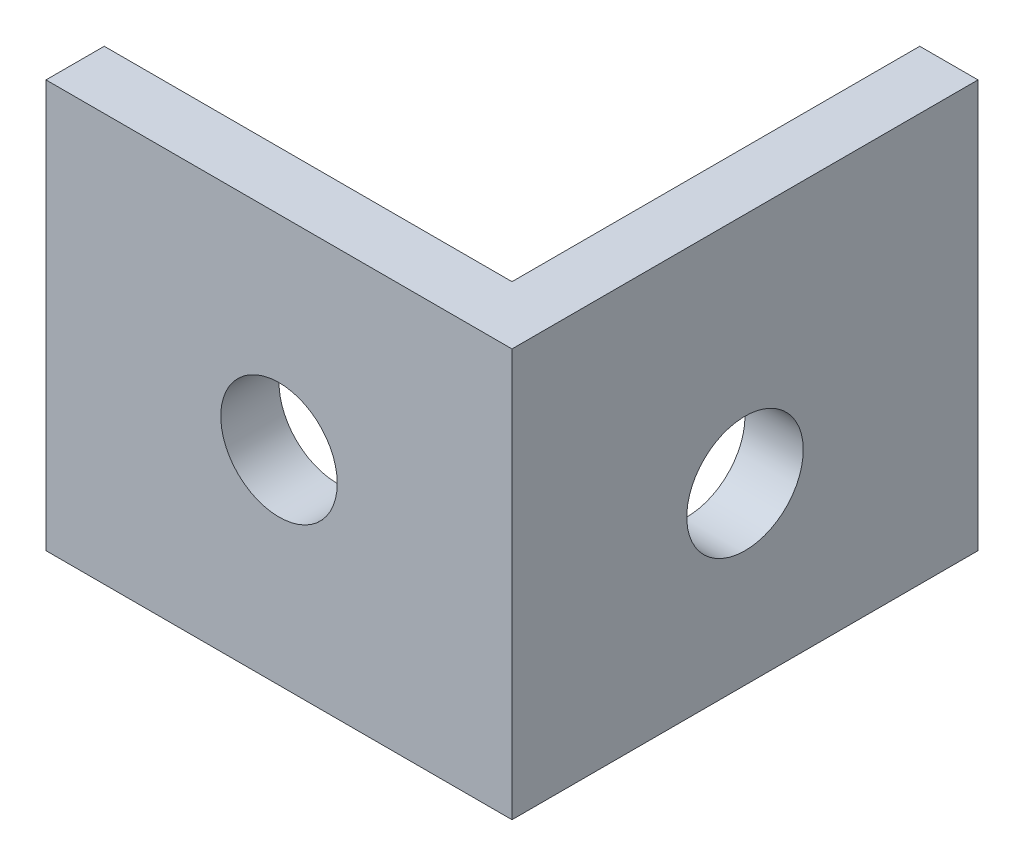
ISO-10303-21;
HEADER;
FILE_DESCRIPTION(('STEP AP214'),'2;1');
FILE_NAME('part.step','',(''),(''),'','','');
FILE_SCHEMA(('AUTOMOTIVE_DESIGN { 1 0 10303 214 1 1 1 1 }'));
ENDSEC;
DATA;
#1=APPLICATION_CONTEXT('core data for automotive mechanical design processes');
#2=APPLICATION_PROTOCOL_DEFINITION('international standard','automotive_design',2000,#1);
#3=PRODUCT_CONTEXT('',#1,'mechanical');
#4=PRODUCT('Part','Part','',(#3));
#5=PRODUCT_RELATED_PRODUCT_CATEGORY('part','',(#4));
#6=PRODUCT_DEFINITION_FORMATION('','',#4);
#7=PRODUCT_DEFINITION_CONTEXT('part definition',#1,'design');
#8=PRODUCT_DEFINITION('design','',#6,#7);
#9=PRODUCT_DEFINITION_SHAPE('','',#8);
#10=(LENGTH_UNIT() NAMED_UNIT(*) SI_UNIT(.MILLI.,.METRE.));
#11=(NAMED_UNIT(*) PLANE_ANGLE_UNIT() SI_UNIT($,.RADIAN.));
#12=(NAMED_UNIT(*) SI_UNIT($,.STERADIAN.) SOLID_ANGLE_UNIT());
#13=UNCERTAINTY_MEASURE_WITH_UNIT(LENGTH_MEASURE(1.E-05),#10,'distance_accuracy_value','');
#14=(GEOMETRIC_REPRESENTATION_CONTEXT(3) GLOBAL_UNCERTAINTY_ASSIGNED_CONTEXT((#13)) GLOBAL_UNIT_ASSIGNED_CONTEXT((#10,
#11,#12)) REPRESENTATION_CONTEXT('',''));
#15=CARTESIAN_POINT('',(0.,0.,0.));
#16=DIRECTION('',(0.,0.,1.));
#17=DIRECTION('',(1.,0.,0.));
#18=AXIS2_PLACEMENT_3D('',#15,#16,#17);
#19=CARTESIAN_POINT('',(0.,22.225,-3.175));
#20=DIRECTION('',(1.,0.,0.));
#21=DIRECTION('',(0.,0.,-1.));
#22=AXIS2_PLACEMENT_3D('',#19,#20,#21);
#23=PLANE('',#22);
#24=DIRECTION('',(0.,0.,1.));
#25=VECTOR('',#24,1.);
#26=CARTESIAN_POINT('',(0.,0.,-3.175));
#27=LINE('',#26,#25);
#28=CARTESIAN_POINT('',(0.,0.,-3.175));
#29=VERTEX_POINT('',#28);
#30=CARTESIAN_POINT('',(0.,0.,0.));
#31=VERTEX_POINT('',#30);
#32=EDGE_CURVE('E119',#29,#31,#27,.T.);
#33=ORIENTED_EDGE('',*,*,#32,.T.);
#34=DIRECTION('',(0.,-1.,0.));
#35=VECTOR('',#34,1.);
#36=CARTESIAN_POINT('',(0.,22.225,0.));
#37=LINE('',#36,#35);
#38=CARTESIAN_POINT('',(0.,22.225,0.));
#39=VERTEX_POINT('',#38);
#40=EDGE_CURVE('E11',#39,#31,#37,.T.);
#41=ORIENTED_EDGE('',*,*,#40,.F.);
#42=DIRECTION('',(0.,0.,1.));
#43=VECTOR('',#42,1.);
#44=CARTESIAN_POINT('',(0.,22.225,-3.175));
#45=LINE('',#44,#43);
#46=CARTESIAN_POINT('',(0.,22.225,-3.175));
#47=VERTEX_POINT('',#46);
#48=EDGE_CURVE('E130',#47,#39,#45,.T.);
#49=ORIENTED_EDGE('',*,*,#48,.F.);
#50=DIRECTION('',(0.,-1.,0.));
#51=VECTOR('',#50,1.);
#52=CARTESIAN_POINT('',(0.,22.225,-3.175));
#53=LINE('',#52,#51);
#54=EDGE_CURVE('E115',#47,#29,#53,.T.);
#55=ORIENTED_EDGE('',*,*,#54,.T.);
#56=EDGE_LOOP('',(#33,#41,#49,#55));
#57=FACE_BOUND('',#56,.T.);
#58=ADVANCED_FACE('F33',(#57),#23,.F.);
#59=CARTESIAN_POINT('',(0.,22.225,0.));
#60=DIRECTION('',(0.,0.,-1.));
#61=DIRECTION('',(-1.,0.,0.));
#62=AXIS2_PLACEMENT_3D('',#59,#60,#61);
#63=PLANE('',#62);
#64=CARTESIAN_POINT('',(12.7,11.1125,0.));
#65=DIRECTION('',(0.,0.,1.));
#66=DIRECTION('',(1.,0.,0.));
#67=AXIS2_PLACEMENT_3D('',#64,#65,#66);
#68=CIRCLE('',#67,3.175);
#69=CARTESIAN_POINT('',(15.875,11.1125,0.));
#70=VERTEX_POINT('',#69);
#71=EDGE_CURVE('E144',#70,#70,#68,.T.);
#72=ORIENTED_EDGE('',*,*,#71,.F.);
#73=EDGE_LOOP('',(#72));
#74=FACE_BOUND('',#73,.T.);
#75=DIRECTION('',(1.,0.,0.));
#76=VECTOR('',#75,1.);
#77=CARTESIAN_POINT('',(0.,0.,0.));
#78=LINE('',#77,#76);
#79=CARTESIAN_POINT('',(25.4,0.,0.));
#80=VERTEX_POINT('',#79);
#81=EDGE_CURVE('E122',#31,#80,#78,.T.);
#82=ORIENTED_EDGE('',*,*,#81,.T.);
#83=DIRECTION('',(0.,-1.,0.));
#84=VECTOR('',#83,1.);
#85=CARTESIAN_POINT('',(25.4,22.225,0.));
#86=LINE('',#85,#84);
#87=CARTESIAN_POINT('',(25.4,22.225,0.));
#88=VERTEX_POINT('',#87);
#89=EDGE_CURVE('E42',#88,#80,#86,.T.);
#90=ORIENTED_EDGE('',*,*,#89,.F.);
#91=DIRECTION('',(1.,0.,0.));
#92=VECTOR('',#91,1.);
#93=CARTESIAN_POINT('',(0.,22.225,0.));
#94=LINE('',#93,#92);
#95=EDGE_CURVE('E88',#39,#88,#94,.T.);
#96=ORIENTED_EDGE('',*,*,#95,.F.);
#97=ORIENTED_EDGE('',*,*,#40,.T.);
#98=EDGE_LOOP('',(#82,#90,#96,#97));
#99=FACE_BOUND('',#98,.T.);
#100=ADVANCED_FACE('F150',(#74,#99),#63,.F.);
#101=CARTESIAN_POINT('',(25.4,22.225,0.));
#102=DIRECTION('',(-1.,0.,0.));
#103=DIRECTION('',(0.,0.,1.));
#104=AXIS2_PLACEMENT_3D('',#101,#102,#103);
#105=PLANE('',#104);
#106=CARTESIAN_POINT('',(25.4,9.525,-12.7));
#107=DIRECTION('',(1.,0.,0.));
#108=DIRECTION('',(0.,0.,-1.));
#109=AXIS2_PLACEMENT_3D('',#106,#107,#108);
#110=CIRCLE('',#109,3.175);
#111=CARTESIAN_POINT('',(25.4,9.525,-15.875));
#112=VERTEX_POINT('',#111);
#113=EDGE_CURVE('E136',#112,#112,#110,.T.);
#114=ORIENTED_EDGE('',*,*,#113,.F.);
#115=EDGE_LOOP('',(#114));
#116=FACE_BOUND('',#115,.T.);
#117=DIRECTION('',(0.,0.,-1.));
#118=VECTOR('',#117,1.);
#119=CARTESIAN_POINT('',(25.4,0.,0.));
#120=LINE('',#119,#118);
#121=CARTESIAN_POINT('',(25.4,0.,-25.4));
#122=VERTEX_POINT('',#121);
#123=EDGE_CURVE('E125',#80,#122,#120,.T.);
#124=ORIENTED_EDGE('',*,*,#123,.T.);
#125=DIRECTION('',(0.,-1.,0.));
#126=VECTOR('',#125,1.);
#127=CARTESIAN_POINT('',(25.4,22.225,-25.4));
#128=LINE('',#127,#126);
#129=CARTESIAN_POINT('',(25.4,22.225,-25.4));
#130=VERTEX_POINT('',#129);
#131=EDGE_CURVE('E110',#130,#122,#128,.T.);
#132=ORIENTED_EDGE('',*,*,#131,.F.);
#133=DIRECTION('',(0.,0.,-1.));
#134=VECTOR('',#133,1.);
#135=CARTESIAN_POINT('',(25.4,22.225,0.));
#136=LINE('',#135,#134);
#137=EDGE_CURVE('E101',#88,#130,#136,.T.);
#138=ORIENTED_EDGE('',*,*,#137,.F.);
#139=ORIENTED_EDGE('',*,*,#89,.T.);
#140=EDGE_LOOP('',(#124,#132,#138,#139));
#141=FACE_BOUND('',#140,.T.);
#142=ADVANCED_FACE('F153',(#116,#141),#105,.F.);
#143=CARTESIAN_POINT('',(25.4,22.225,-25.4));
#144=DIRECTION('',(0.,0.,1.));
#145=DIRECTION('',(1.,0.,0.));
#146=AXIS2_PLACEMENT_3D('',#143,#144,#145);
#147=PLANE('',#146);
#148=DIRECTION('',(-1.,0.,0.));
#149=VECTOR('',#148,1.);
#150=CARTESIAN_POINT('',(25.4,0.,-25.4));
#151=LINE('',#150,#149);
#152=CARTESIAN_POINT('',(22.225,0.,-25.4));
#153=VERTEX_POINT('',#152);
#154=EDGE_CURVE('E109',#122,#153,#151,.T.);
#155=ORIENTED_EDGE('',*,*,#154,.T.);
#156=DIRECTION('',(0.,-1.,0.));
#157=VECTOR('',#156,1.);
#158=CARTESIAN_POINT('',(22.225,22.225,-25.4));
#159=LINE('',#158,#157);
#160=CARTESIAN_POINT('',(22.225,22.225,-25.4));
#161=VERTEX_POINT('',#160);
#162=EDGE_CURVE('E106',#161,#153,#159,.T.);
#163=ORIENTED_EDGE('',*,*,#162,.F.);
#164=DIRECTION('',(-1.,0.,0.));
#165=VECTOR('',#164,1.);
#166=CARTESIAN_POINT('',(25.4,22.225,-25.4));
#167=LINE('',#166,#165);
#168=EDGE_CURVE('E95',#130,#161,#167,.T.);
#169=ORIENTED_EDGE('',*,*,#168,.F.);
#170=ORIENTED_EDGE('',*,*,#131,.T.);
#171=EDGE_LOOP('',(#155,#163,#169,#170));
#172=FACE_BOUND('',#171,.T.);
#173=ADVANCED_FACE('F107',(#172),#147,.F.);
#174=CARTESIAN_POINT('',(22.225,22.225,-25.4));
#175=DIRECTION('',(1.,0.,0.));
#176=DIRECTION('',(0.,0.,-1.));
#177=AXIS2_PLACEMENT_3D('',#174,#175,#176);
#178=PLANE('',#177);
#179=CARTESIAN_POINT('',(22.225,9.525,-12.7));
#180=DIRECTION('',(1.,0.,0.));
#181=DIRECTION('',(0.,0.,-1.));
#182=AXIS2_PLACEMENT_3D('',#179,#180,#181);
#183=CIRCLE('',#182,3.175);
#184=CARTESIAN_POINT('',(22.225,9.525,-15.875));
#185=VERTEX_POINT('',#184);
#186=EDGE_CURVE('E123',#185,#185,#183,.T.);
#187=ORIENTED_EDGE('',*,*,#186,.T.);
#188=EDGE_LOOP('',(#187));
#189=FACE_BOUND('',#188,.T.);
#190=DIRECTION('',(0.,0.,1.));
#191=VECTOR('',#190,1.);
#192=CARTESIAN_POINT('',(22.225,0.,-25.4));
#193=LINE('',#192,#191);
#194=CARTESIAN_POINT('',(22.225,0.,-3.175));
#195=VERTEX_POINT('',#194);
#196=EDGE_CURVE('E74',#153,#195,#193,.T.);
#197=ORIENTED_EDGE('',*,*,#196,.T.);
#198=DIRECTION('',(0.,-1.,0.));
#199=VECTOR('',#198,1.);
#200=CARTESIAN_POINT('',(22.225,22.225,-3.175));
#201=LINE('',#200,#199);
#202=CARTESIAN_POINT('',(22.225,22.225,-3.175));
#203=VERTEX_POINT('',#202);
#204=EDGE_CURVE('E111',#203,#195,#201,.T.);
#205=ORIENTED_EDGE('',*,*,#204,.F.);
#206=DIRECTION('',(0.,0.,1.));
#207=VECTOR('',#206,1.);
#208=CARTESIAN_POINT('',(22.225,22.225,-25.4));
#209=LINE('',#208,#207);
#210=EDGE_CURVE('E99',#161,#203,#209,.T.);
#211=ORIENTED_EDGE('',*,*,#210,.F.);
#212=ORIENTED_EDGE('',*,*,#162,.T.);
#213=EDGE_LOOP('',(#197,#205,#211,#212));
#214=FACE_BOUND('',#213,.T.);
#215=ADVANCED_FACE('F113',(#189,#214),#178,.F.);
#216=CARTESIAN_POINT('',(22.225,22.225,-3.175));
#217=DIRECTION('',(0.,0.,1.));
#218=DIRECTION('',(1.,0.,0.));
#219=AXIS2_PLACEMENT_3D('',#216,#217,#218);
#220=PLANE('',#219);
#221=CARTESIAN_POINT('',(12.7,11.1125,-3.175));
#222=DIRECTION('',(0.,0.,1.));
#223=DIRECTION('',(1.,0.,0.));
#224=AXIS2_PLACEMENT_3D('',#221,#222,#223);
#225=CIRCLE('',#224,3.175);
#226=CARTESIAN_POINT('',(15.875,11.1125,-3.175));
#227=VERTEX_POINT('',#226);
#228=EDGE_CURVE('E36',#227,#227,#225,.T.);
#229=ORIENTED_EDGE('',*,*,#228,.T.);
#230=EDGE_LOOP('',(#229));
#231=FACE_BOUND('',#230,.T.);
#232=DIRECTION('',(-1.,0.,0.));
#233=VECTOR('',#232,1.);
#234=CARTESIAN_POINT('',(22.225,0.,-3.175));
#235=LINE('',#234,#233);
#236=EDGE_CURVE('E80',#195,#29,#235,.T.);
#237=ORIENTED_EDGE('',*,*,#236,.T.);
#238=ORIENTED_EDGE('',*,*,#54,.F.);
#239=DIRECTION('',(-1.,0.,0.));
#240=VECTOR('',#239,1.);
#241=CARTESIAN_POINT('',(22.225,22.225,-3.175));
#242=LINE('',#241,#240);
#243=EDGE_CURVE('E51',#203,#47,#242,.T.);
#244=ORIENTED_EDGE('',*,*,#243,.F.);
#245=ORIENTED_EDGE('',*,*,#204,.T.);
#246=EDGE_LOOP('',(#237,#238,#244,#245));
#247=FACE_BOUND('',#246,.T.);
#248=ADVANCED_FACE('F158',(#231,#247),#220,.F.);
#249=CARTESIAN_POINT('',(0.,22.225,0.));
#250=DIRECTION('',(0.,1.,0.));
#251=DIRECTION('',(0.,0.,1.));
#252=AXIS2_PLACEMENT_3D('',#249,#250,#251);
#253=PLANE('',#252);
#254=ORIENTED_EDGE('',*,*,#48,.T.);
#255=ORIENTED_EDGE('',*,*,#95,.T.);
#256=ORIENTED_EDGE('',*,*,#137,.T.);
#257=ORIENTED_EDGE('',*,*,#168,.T.);
#258=ORIENTED_EDGE('',*,*,#210,.T.);
#259=ORIENTED_EDGE('',*,*,#243,.T.);
#260=EDGE_LOOP('',(#254,#255,#256,#257,#258,#259));
#261=FACE_BOUND('',#260,.T.);
#262=ADVANCED_FACE('F97',(#261),#253,.T.);
#263=CARTESIAN_POINT('',(0.,0.,0.));
#264=DIRECTION('',(0.,1.,0.));
#265=DIRECTION('',(0.,0.,1.));
#266=AXIS2_PLACEMENT_3D('',#263,#264,#265);
#267=PLANE('',#266);
#268=ORIENTED_EDGE('',*,*,#32,.F.);
#269=ORIENTED_EDGE('',*,*,#236,.F.);
#270=ORIENTED_EDGE('',*,*,#196,.F.);
#271=ORIENTED_EDGE('',*,*,#154,.F.);
#272=ORIENTED_EDGE('',*,*,#123,.F.);
#273=ORIENTED_EDGE('',*,*,#81,.F.);
#274=EDGE_LOOP('',(#268,#269,#270,#271,#272,#273));
#275=FACE_BOUND('',#274,.T.);
#276=ADVANCED_FACE('F156',(#275),#267,.F.);
#277=CARTESIAN_POINT('',(0.,9.525,-12.7));
#278=DIRECTION('',(1.,0.,0.));
#279=DIRECTION('',(0.,0.,-1.));
#280=AXIS2_PLACEMENT_3D('',#277,#278,#279);
#281=CYLINDRICAL_SURFACE('',#280,3.175);
#282=ORIENTED_EDGE('',*,*,#113,.T.);
#283=EDGE_LOOP('',(#282));
#284=FACE_BOUND('',#283,.T.);
#285=ORIENTED_EDGE('',*,*,#186,.F.);
#286=EDGE_LOOP('',(#285));
#287=FACE_BOUND('',#286,.T.);
#288=ADVANCED_FACE('F200',(#284,#287),#281,.F.);
#289=CARTESIAN_POINT('',(12.7,11.1125,-25.4));
#290=DIRECTION('',(0.,0.,1.));
#291=DIRECTION('',(1.,0.,0.));
#292=AXIS2_PLACEMENT_3D('',#289,#290,#291);
#293=CYLINDRICAL_SURFACE('',#292,3.175);
#294=ORIENTED_EDGE('',*,*,#71,.T.);
#295=EDGE_LOOP('',(#294));
#296=FACE_BOUND('',#295,.T.);
#297=ORIENTED_EDGE('',*,*,#228,.F.);
#298=EDGE_LOOP('',(#297));
#299=FACE_BOUND('',#298,.T.);
#300=ADVANCED_FACE('F204',(#296,#299),#293,.F.);
#301=CLOSED_SHELL('',(#58,#100,#142,#173,#215,#248,#262,#276,#288,#300));
#302=MANIFOLD_SOLID_BREP('B2',#301);
#303=ADVANCED_BREP_SHAPE_REPRESENTATION('',(#18,#302),#14);
#304=SHAPE_DEFINITION_REPRESENTATION(#9,#303);
ENDSEC;
END-ISO-10303-21;
